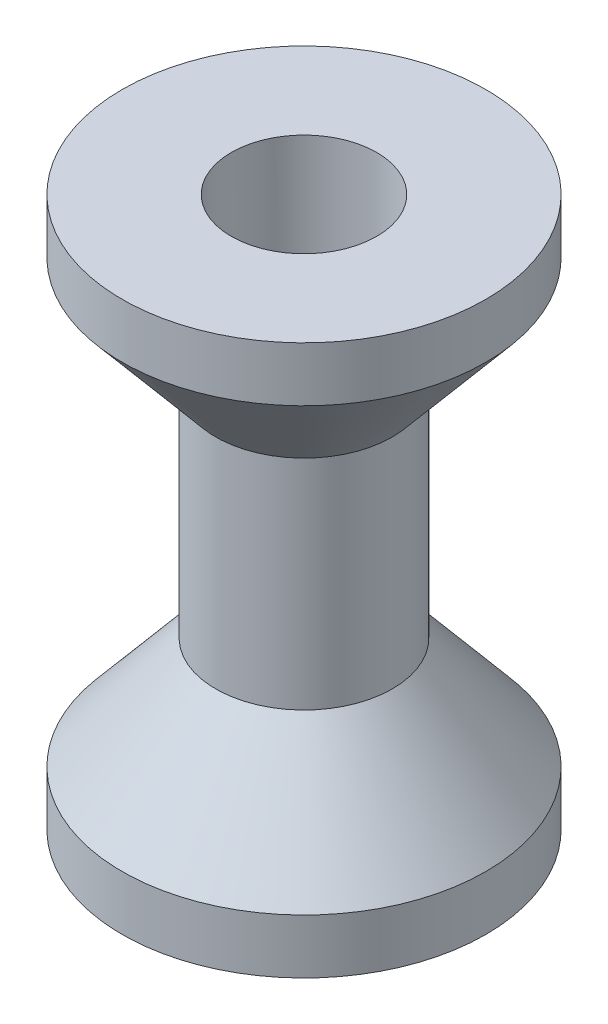
ISO-10303-21;
HEADER;
FILE_DESCRIPTION(('STEP AP214'),'2;1');
FILE_NAME('part.step','',(''),(''),'','','');
FILE_SCHEMA(('AUTOMOTIVE_DESIGN { 1 0 10303 214 1 1 1 1 }'));
ENDSEC;
DATA;
#1=APPLICATION_CONTEXT('core data for automotive mechanical design processes');
#2=APPLICATION_PROTOCOL_DEFINITION('international standard','automotive_design',2000,#1);
#3=PRODUCT_CONTEXT('',#1,'mechanical');
#4=PRODUCT('Part','Part','',(#3));
#5=PRODUCT_RELATED_PRODUCT_CATEGORY('part','',(#4));
#6=PRODUCT_DEFINITION_FORMATION('','',#4);
#7=PRODUCT_DEFINITION_CONTEXT('part definition',#1,'design');
#8=PRODUCT_DEFINITION('design','',#6,#7);
#9=PRODUCT_DEFINITION_SHAPE('','',#8);
#10=(LENGTH_UNIT() NAMED_UNIT(*) SI_UNIT(.MILLI.,.METRE.));
#11=(NAMED_UNIT(*) PLANE_ANGLE_UNIT() SI_UNIT($,.RADIAN.));
#12=(NAMED_UNIT(*) SI_UNIT($,.STERADIAN.) SOLID_ANGLE_UNIT());
#13=UNCERTAINTY_MEASURE_WITH_UNIT(LENGTH_MEASURE(1.E-05),#10,'distance_accuracy_value','');
#14=(GEOMETRIC_REPRESENTATION_CONTEXT(3) GLOBAL_UNCERTAINTY_ASSIGNED_CONTEXT((#13)) GLOBAL_UNIT_ASSIGNED_CONTEXT((#10,
#11,#12)) REPRESENTATION_CONTEXT('',''));
#15=CARTESIAN_POINT('',(0.,0.,0.));
#16=DIRECTION('',(0.,0.,1.));
#17=DIRECTION('',(1.,0.,0.));
#18=AXIS2_PLACEMENT_3D('',#15,#16,#17);
#19=CARTESIAN_POINT('',(4.85769912250772,15.1293555449518,0.));
#20=DIRECTION('',(0.,-1.,0.));
#21=DIRECTION('',(1.,0.,0.));
#22=AXIS2_PLACEMENT_3D('',#19,#20,#21);
#23=CYLINDRICAL_SURFACE('',#22,4.);
#24=CARTESIAN_POINT('',(4.85769912250772,15.1283555449519,0.));
#25=DIRECTION('',(0.,1.,0.));
#26=DIRECTION('',(-1.,0.,0.));
#27=AXIS2_PLACEMENT_3D('',#24,#25,#26);
#28=CIRCLE('',#27,4.);
#29=CARTESIAN_POINT('',(0.857699122507718,15.1283555449519,0.));
#30=VERTEX_POINT('',#29);
#31=EDGE_CURVE('E58',#30,#30,#28,.F.);
#32=ORIENTED_EDGE('',*,*,#31,.F.);
#33=EDGE_LOOP('',(#32));
#34=FACE_BOUND('',#33,.T.);
#35=CARTESIAN_POINT('',(4.85769912250772,-10.1283555449518,0.));
#36=DIRECTION('',(0.,-1.,0.));
#37=DIRECTION('',(1.,0.,0.));
#38=AXIS2_PLACEMENT_3D('',#35,#36,#37);
#39=CIRCLE('',#38,4.);
#40=CARTESIAN_POINT('',(8.85769912250772,-10.1283555449518,0.));
#41=VERTEX_POINT('',#40);
#42=EDGE_CURVE('E36',#41,#41,#39,.F.);
#43=ORIENTED_EDGE('',*,*,#42,.F.);
#44=EDGE_LOOP('',(#43));
#45=FACE_BOUND('',#44,.T.);
#46=ADVANCED_FACE('F32',(#34,#45),#23,.F.);
#47=CARTESIAN_POINT('',(4.85769912250772,-6.,0.));
#48=DIRECTION('',(0.,-1.,0.));
#49=DIRECTION('',(1.,0.,0.));
#50=AXIS2_PLACEMENT_3D('',#47,#48,#49);
#51=CONICAL_SURFACE('',#50,4.85769912250772,0.698131700797733);
#52=CARTESIAN_POINT('',(4.85769912250772,-12.1283555449518,0.));
#53=DIRECTION('',(0.,1.,0.));
#54=DIRECTION('',(-1.,0.,0.));
#55=AXIS2_PLACEMENT_3D('',#52,#53,#54);
#56=CIRCLE('',#55,10.);
#57=CARTESIAN_POINT('',(-5.14230087749232,-12.1283555449518,0.));
#58=VERTEX_POINT('',#57);
#59=EDGE_CURVE('E55',#58,#58,#56,.T.);
#60=ORIENTED_EDGE('',*,*,#59,.T.);
#61=EDGE_LOOP('',(#60));
#62=FACE_BOUND('',#61,.T.);
#63=CARTESIAN_POINT('',(4.85769912250772,-6.,0.));
#64=DIRECTION('',(0.,1.,0.));
#65=DIRECTION('',(-1.,0.,0.));
#66=AXIS2_PLACEMENT_3D('',#63,#64,#65);
#67=CIRCLE('',#66,4.85769912250772);
#68=CARTESIAN_POINT('',(0.,-6.,0.));
#69=VERTEX_POINT('',#68);
#70=EDGE_CURVE('E10',#69,#69,#67,.T.);
#71=ORIENTED_EDGE('',*,*,#70,.F.);
#72=EDGE_LOOP('',(#71));
#73=FACE_BOUND('',#72,.T.);
#74=ADVANCED_FACE('F34',(#62,#73),#51,.T.);
#75=CARTESIAN_POINT('',(4.85769912250772,15.1283555449518,0.));
#76=DIRECTION('',(0.,1.,0.));
#77=DIRECTION('',(-1.,0.,0.));
#78=AXIS2_PLACEMENT_3D('',#75,#76,#77);
#79=CYLINDRICAL_SURFACE('',#78,4.85769912250772);
#80=ORIENTED_EDGE('',*,*,#70,.T.);
#81=EDGE_LOOP('',(#80));
#82=FACE_BOUND('',#81,.T.);
#83=CARTESIAN_POINT('',(4.85769912250772,6.,0.));
#84=DIRECTION('',(0.,1.,0.));
#85=DIRECTION('',(-1.,0.,0.));
#86=AXIS2_PLACEMENT_3D('',#83,#84,#85);
#87=CIRCLE('',#86,4.85769912250772);
#88=CARTESIAN_POINT('',(0.,6.,0.));
#89=VERTEX_POINT('',#88);
#90=EDGE_CURVE('E40',#89,#89,#87,.T.);
#91=ORIENTED_EDGE('',*,*,#90,.F.);
#92=EDGE_LOOP('',(#91));
#93=FACE_BOUND('',#92,.T.);
#94=ADVANCED_FACE('F79',(#82,#93),#79,.T.);
#95=CARTESIAN_POINT('',(4.85769912250772,12.1283555449519,0.));
#96=DIRECTION('',(0.,1.,0.));
#97=DIRECTION('',(-1.,0.,0.));
#98=AXIS2_PLACEMENT_3D('',#95,#96,#97);
#99=CONICAL_SURFACE('',#98,10.,0.698131700797726);
#100=ORIENTED_EDGE('',*,*,#90,.T.);
#101=EDGE_LOOP('',(#100));
#102=FACE_BOUND('',#101,.T.);
#103=CARTESIAN_POINT('',(4.85769912250772,12.1283555449519,0.));
#104=DIRECTION('',(0.,1.,0.));
#105=DIRECTION('',(-1.,0.,0.));
#106=AXIS2_PLACEMENT_3D('',#103,#104,#105);
#107=CIRCLE('',#106,10.);
#108=CARTESIAN_POINT('',(-5.14230087749228,12.1283555449519,0.));
#109=VERTEX_POINT('',#108);
#110=EDGE_CURVE('E44',#109,#109,#107,.T.);
#111=ORIENTED_EDGE('',*,*,#110,.F.);
#112=EDGE_LOOP('',(#111));
#113=FACE_BOUND('',#112,.T.);
#114=ADVANCED_FACE('F101',(#102,#113),#99,.T.);
#115=CARTESIAN_POINT('',(4.85769912250772,15.1283555449518,0.));
#116=DIRECTION('',(0.,1.,0.));
#117=DIRECTION('',(-1.,0.,0.));
#118=AXIS2_PLACEMENT_3D('',#115,#116,#117);
#119=CYLINDRICAL_SURFACE('',#118,10.);
#120=ORIENTED_EDGE('',*,*,#110,.T.);
#121=EDGE_LOOP('',(#120));
#122=FACE_BOUND('',#121,.T.);
#123=CARTESIAN_POINT('',(4.85769912250772,15.1283555449519,0.));
#124=DIRECTION('',(0.,1.,0.));
#125=DIRECTION('',(-1.,0.,0.));
#126=AXIS2_PLACEMENT_3D('',#123,#124,#125);
#127=CIRCLE('',#126,10.);
#128=CARTESIAN_POINT('',(-5.14230087749228,15.1283555449518,0.));
#129=VERTEX_POINT('',#128);
#130=EDGE_CURVE('E49',#129,#129,#127,.T.);
#131=ORIENTED_EDGE('',*,*,#130,.F.);
#132=EDGE_LOOP('',(#131));
#133=FACE_BOUND('',#132,.T.);
#134=ADVANCED_FACE('F97',(#122,#133),#119,.T.);
#135=CARTESIAN_POINT('',(-5.14230087749228,15.1283555449518,0.));
#136=DIRECTION('',(0.,1.,0.));
#137=DIRECTION('',(-1.,0.,0.));
#138=AXIS2_PLACEMENT_3D('',#135,#136,#137);
#139=PLANE('',#138);
#140=ORIENTED_EDGE('',*,*,#31,.T.);
#141=EDGE_LOOP('',(#140));
#142=FACE_BOUND('',#141,.T.);
#143=ORIENTED_EDGE('',*,*,#130,.T.);
#144=EDGE_LOOP('',(#143));
#145=FACE_BOUND('',#144,.T.);
#146=ADVANCED_FACE('F93',(#142,#145),#139,.T.);
#147=CARTESIAN_POINT('',(-5.14230087749232,-15.1283555449518,0.));
#148=DIRECTION('',(0.,-1.,0.));
#149=DIRECTION('',(1.,0.,0.));
#150=AXIS2_PLACEMENT_3D('',#147,#148,#149);
#151=PLANE('',#150);
#152=CARTESIAN_POINT('',(4.85769912250772,-15.1283555449518,0.));
#153=DIRECTION('',(0.,-1.,0.));
#154=DIRECTION('',(1.,0.,0.));
#155=AXIS2_PLACEMENT_3D('',#152,#153,#154);
#156=CIRCLE('',#155,5.);
#157=CARTESIAN_POINT('',(9.85769912250773,-15.1283555449518,0.));
#158=VERTEX_POINT('',#157);
#159=EDGE_CURVE('E61',#158,#158,#156,.T.);
#160=ORIENTED_EDGE('',*,*,#159,.F.);
#161=EDGE_LOOP('',(#160));
#162=FACE_BOUND('',#161,.T.);
#163=CARTESIAN_POINT('',(4.85769912250772,-15.1283555449518,0.));
#164=DIRECTION('',(0.,1.,0.));
#165=DIRECTION('',(-1.,0.,0.));
#166=AXIS2_PLACEMENT_3D('',#163,#164,#165);
#167=CIRCLE('',#166,10.);
#168=CARTESIAN_POINT('',(-5.14230087749232,-15.1283555449518,0.));
#169=VERTEX_POINT('',#168);
#170=EDGE_CURVE('E52',#169,#169,#167,.T.);
#171=ORIENTED_EDGE('',*,*,#170,.F.);
#172=EDGE_LOOP('',(#171));
#173=FACE_BOUND('',#172,.T.);
#174=ADVANCED_FACE('F89',(#162,#173),#151,.T.);
#175=CARTESIAN_POINT('',(4.85769912250772,15.1283555449518,0.));
#176=DIRECTION('',(0.,1.,0.));
#177=DIRECTION('',(-1.,0.,0.));
#178=AXIS2_PLACEMENT_3D('',#175,#176,#177);
#179=CYLINDRICAL_SURFACE('',#178,10.);
#180=ORIENTED_EDGE('',*,*,#170,.T.);
#181=EDGE_LOOP('',(#180));
#182=FACE_BOUND('',#181,.T.);
#183=ORIENTED_EDGE('',*,*,#59,.F.);
#184=EDGE_LOOP('',(#183));
#185=FACE_BOUND('',#184,.T.);
#186=ADVANCED_FACE('F86',(#182,#185),#179,.T.);
#187=CARTESIAN_POINT('',(4.85769912250772,-10.1283555449518,0.));
#188=DIRECTION('',(0.,-1.,0.));
#189=DIRECTION('',(1.,0.,0.));
#190=AXIS2_PLACEMENT_3D('',#187,#188,#189);
#191=PLANE('',#190);
#192=CARTESIAN_POINT('',(4.85769912250772,-10.1283555449518,0.));
#193=DIRECTION('',(0.,-1.,0.));
#194=DIRECTION('',(1.,0.,0.));
#195=AXIS2_PLACEMENT_3D('',#192,#193,#194);
#196=CIRCLE('',#195,5.);
#197=CARTESIAN_POINT('',(9.85769912250772,-10.1283555449518,0.));
#198=VERTEX_POINT('',#197);
#199=EDGE_CURVE('E64',#198,#198,#196,.T.);
#200=ORIENTED_EDGE('',*,*,#199,.T.);
#201=EDGE_LOOP('',(#200));
#202=FACE_BOUND('',#201,.T.);
#203=ORIENTED_EDGE('',*,*,#42,.T.);
#204=EDGE_LOOP('',(#203));
#205=FACE_BOUND('',#204,.T.);
#206=ADVANCED_FACE('F71',(#202,#205),#191,.T.);
#207=CARTESIAN_POINT('',(4.85769912250772,-10.1283555449518,0.));
#208=DIRECTION('',(0.,-1.,0.));
#209=DIRECTION('',(1.,0.,0.));
#210=AXIS2_PLACEMENT_3D('',#207,#208,#209);
#211=CYLINDRICAL_SURFACE('',#210,5.);
#212=ORIENTED_EDGE('',*,*,#199,.F.);
#213=EDGE_LOOP('',(#212));
#214=FACE_BOUND('',#213,.T.);
#215=ORIENTED_EDGE('',*,*,#159,.T.);
#216=EDGE_LOOP('',(#215));
#217=FACE_BOUND('',#216,.T.);
#218=ADVANCED_FACE('F84',(#214,#217),#211,.F.);
#219=CLOSED_SHELL('',(#46,#74,#94,#114,#134,#146,#174,#186,#206,#218));
#220=MANIFOLD_SOLID_BREP('B2',#219);
#221=ADVANCED_BREP_SHAPE_REPRESENTATION('',(#18,#220),#14);
#222=SHAPE_DEFINITION_REPRESENTATION(#9,#221);
ENDSEC;
END-ISO-10303-21;
